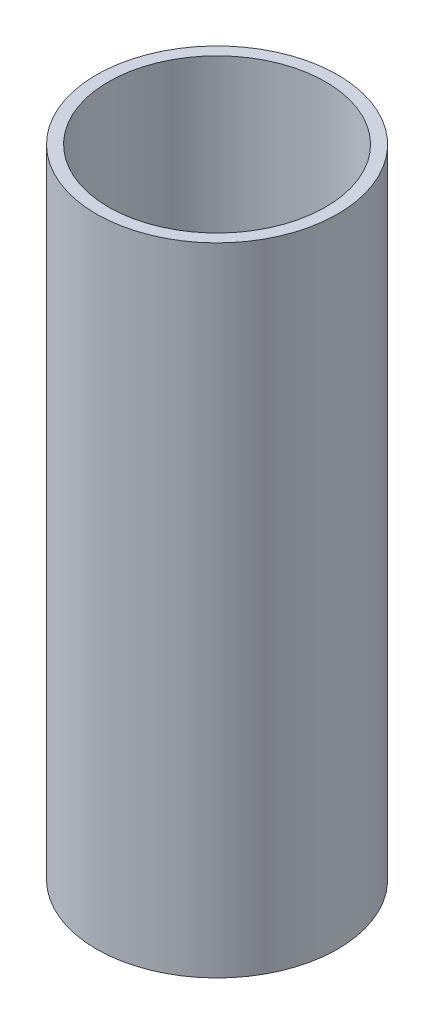
ISO-10303-21;
HEADER;
FILE_DESCRIPTION(('STEP AP214'),'2;1');
FILE_NAME('part.step','',(''),(''),'','','');
FILE_SCHEMA(('AUTOMOTIVE_DESIGN { 1 0 10303 214 1 1 1 1 }'));
ENDSEC;
DATA;
#1=APPLICATION_CONTEXT('core data for automotive mechanical design processes');
#2=APPLICATION_PROTOCOL_DEFINITION('international standard','automotive_design',2000,#1);
#3=PRODUCT_CONTEXT('',#1,'mechanical');
#4=PRODUCT('Part','Part','',(#3));
#5=PRODUCT_RELATED_PRODUCT_CATEGORY('part','',(#4));
#6=PRODUCT_DEFINITION_FORMATION('','',#4);
#7=PRODUCT_DEFINITION_CONTEXT('part definition',#1,'design');
#8=PRODUCT_DEFINITION('design','',#6,#7);
#9=PRODUCT_DEFINITION_SHAPE('','',#8);
#10=(LENGTH_UNIT() NAMED_UNIT(*) SI_UNIT(.MILLI.,.METRE.));
#11=(NAMED_UNIT(*) PLANE_ANGLE_UNIT() SI_UNIT($,.RADIAN.));
#12=(NAMED_UNIT(*) SI_UNIT($,.STERADIAN.) SOLID_ANGLE_UNIT());
#13=UNCERTAINTY_MEASURE_WITH_UNIT(LENGTH_MEASURE(1.E-05),#10,'distance_accuracy_value','');
#14=(GEOMETRIC_REPRESENTATION_CONTEXT(3) GLOBAL_UNCERTAINTY_ASSIGNED_CONTEXT((#13)) GLOBAL_UNIT_ASSIGNED_CONTEXT((#10,
#11,#12)) REPRESENTATION_CONTEXT('',''));
#15=CARTESIAN_POINT('',(0.,0.,0.));
#16=DIRECTION('',(0.,0.,1.));
#17=DIRECTION('',(1.,0.,0.));
#18=AXIS2_PLACEMENT_3D('',#15,#16,#17);
#19=CARTESIAN_POINT('',(0.,150.8125,0.));
#20=DIRECTION('',(0.,1.,0.));
#21=DIRECTION('',(0.,0.,1.));
#22=AXIS2_PLACEMENT_3D('',#19,#20,#21);
#23=PLANE('',#22);
#24=CARTESIAN_POINT('',(0.,150.8125,0.));
#25=DIRECTION('',(0.,1.,0.));
#26=DIRECTION('',(0.,0.,1.));
#27=AXIS2_PLACEMENT_3D('',#24,#25,#26);
#28=CIRCLE('',#27,57.15);
#29=CARTESIAN_POINT('',(0.,150.8125,57.15));
#30=VERTEX_POINT('',#29);
#31=EDGE_CURVE('E10',#30,#30,#28,.T.);
#32=ORIENTED_EDGE('',*,*,#31,.T.);
#33=EDGE_LOOP('',(#32));
#34=FACE_BOUND('',#33,.T.);
#35=CARTESIAN_POINT('',(0.,150.8125,0.));
#36=DIRECTION('',(0.,1.,0.));
#37=DIRECTION('',(0.,0.,1.));
#38=AXIS2_PLACEMENT_3D('',#35,#36,#37);
#39=CIRCLE('',#38,51.435);
#40=CARTESIAN_POINT('',(0.,150.8125,51.435));
#41=VERTEX_POINT('',#40);
#42=EDGE_CURVE('E60',#41,#41,#39,.T.);
#43=ORIENTED_EDGE('',*,*,#42,.F.);
#44=EDGE_LOOP('',(#43));
#45=FACE_BOUND('',#44,.T.);
#46=ADVANCED_FACE('F47',(#34,#45),#23,.T.);
#47=CARTESIAN_POINT('',(0.,-150.8125,0.));
#48=DIRECTION('',(0.,1.,0.));
#49=DIRECTION('',(0.,0.,1.));
#50=AXIS2_PLACEMENT_3D('',#47,#48,#49);
#51=PLANE('',#50);
#52=CARTESIAN_POINT('',(0.,-150.8125,0.));
#53=DIRECTION('',(0.,1.,0.));
#54=DIRECTION('',(0.,0.,1.));
#55=AXIS2_PLACEMENT_3D('',#52,#53,#54);
#56=CIRCLE('',#55,57.15);
#57=CARTESIAN_POINT('',(0.,-150.8125,57.15));
#58=VERTEX_POINT('',#57);
#59=EDGE_CURVE('E51',#58,#58,#56,.T.);
#60=ORIENTED_EDGE('',*,*,#59,.F.);
#61=EDGE_LOOP('',(#60));
#62=FACE_BOUND('',#61,.T.);
#63=CARTESIAN_POINT('',(0.,-150.8125,0.));
#64=DIRECTION('',(0.,1.,0.));
#65=DIRECTION('',(0.,0.,1.));
#66=AXIS2_PLACEMENT_3D('',#63,#64,#65);
#67=CIRCLE('',#66,51.435);
#68=CARTESIAN_POINT('',(0.,-150.8125,51.435));
#69=VERTEX_POINT('',#68);
#70=EDGE_CURVE('E62',#69,#69,#67,.T.);
#71=ORIENTED_EDGE('',*,*,#70,.T.);
#72=EDGE_LOOP('',(#71));
#73=FACE_BOUND('',#72,.T.);
#74=ADVANCED_FACE('F74',(#62,#73),#51,.F.);
#75=CARTESIAN_POINT('',(0.,150.8125,0.));
#76=DIRECTION('',(0.,-1.,0.));
#77=DIRECTION('',(0.,0.,-1.));
#78=AXIS2_PLACEMENT_3D('',#75,#76,#77);
#79=CYLINDRICAL_SURFACE('',#78,57.15);
#80=ORIENTED_EDGE('',*,*,#31,.F.);
#81=EDGE_LOOP('',(#80));
#82=FACE_BOUND('',#81,.T.);
#83=ORIENTED_EDGE('',*,*,#59,.T.);
#84=EDGE_LOOP('',(#83));
#85=FACE_BOUND('',#84,.T.);
#86=ADVANCED_FACE('F49',(#82,#85),#79,.T.);
#87=CARTESIAN_POINT('',(0.,150.8125,0.));
#88=DIRECTION('',(0.,-1.,0.));
#89=DIRECTION('',(0.,0.,-1.));
#90=AXIS2_PLACEMENT_3D('',#87,#88,#89);
#91=CYLINDRICAL_SURFACE('',#90,51.435);
#92=ORIENTED_EDGE('',*,*,#42,.T.);
#93=EDGE_LOOP('',(#92));
#94=FACE_BOUND('',#93,.T.);
#95=ORIENTED_EDGE('',*,*,#70,.F.);
#96=EDGE_LOOP('',(#95));
#97=FACE_BOUND('',#96,.T.);
#98=ADVANCED_FACE('F70',(#94,#97),#91,.F.);
#99=CLOSED_SHELL('',(#46,#74,#86,#98));
#100=MANIFOLD_SOLID_BREP('B2',#99);
#101=ADVANCED_BREP_SHAPE_REPRESENTATION('',(#18,#100),#14);
#102=SHAPE_DEFINITION_REPRESENTATION(#9,#101);
ENDSEC;
END-ISO-10303-21;
